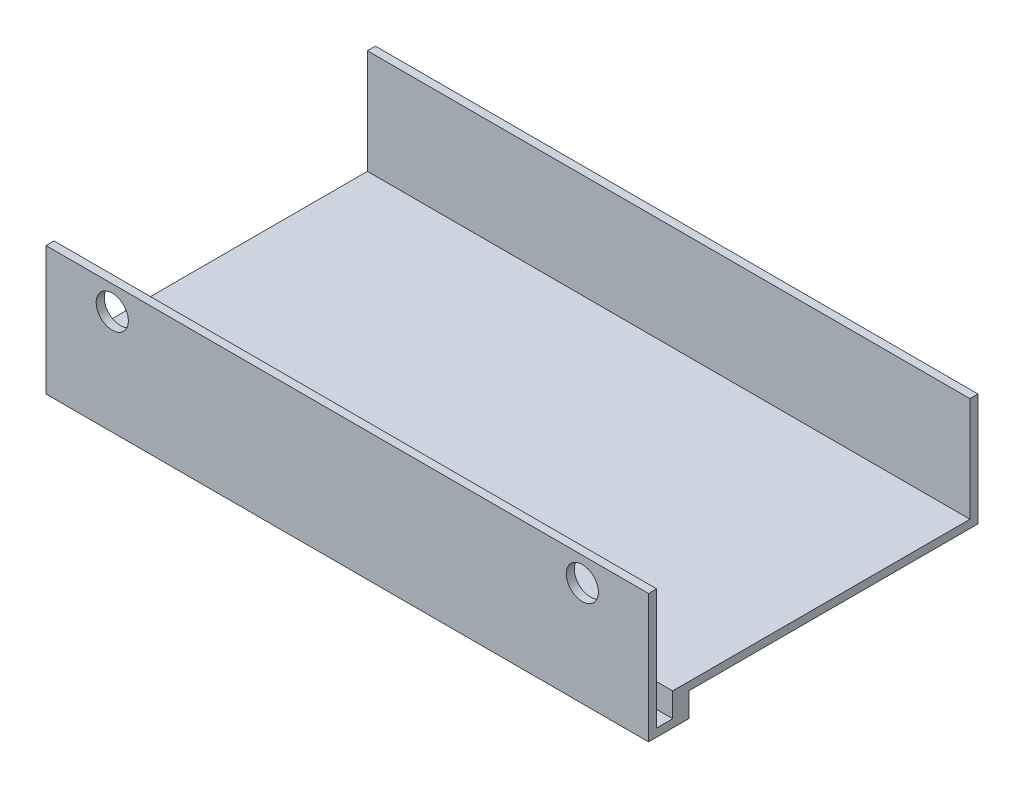
ISO-10303-21;
HEADER;
FILE_DESCRIPTION(('STEP AP214'),'2;1');
FILE_NAME('part.step','',(''),(''),'','','');
FILE_SCHEMA(('AUTOMOTIVE_DESIGN { 1 0 10303 214 1 1 1 1 }'));
ENDSEC;
DATA;
#1=APPLICATION_CONTEXT('core data for automotive mechanical design processes');
#2=APPLICATION_PROTOCOL_DEFINITION('international standard','automotive_design',2000,#1);
#3=PRODUCT_CONTEXT('',#1,'mechanical');
#4=PRODUCT('Part','Part','',(#3));
#5=PRODUCT_RELATED_PRODUCT_CATEGORY('part','',(#4));
#6=PRODUCT_DEFINITION_FORMATION('','',#4);
#7=PRODUCT_DEFINITION_CONTEXT('part definition',#1,'design');
#8=PRODUCT_DEFINITION('design','',#6,#7);
#9=PRODUCT_DEFINITION_SHAPE('','',#8);
#10=(LENGTH_UNIT() NAMED_UNIT(*) SI_UNIT(.MILLI.,.METRE.));
#11=(NAMED_UNIT(*) PLANE_ANGLE_UNIT() SI_UNIT($,.RADIAN.));
#12=(NAMED_UNIT(*) SI_UNIT($,.STERADIAN.) SOLID_ANGLE_UNIT());
#13=UNCERTAINTY_MEASURE_WITH_UNIT(LENGTH_MEASURE(1.E-05),#10,'distance_accuracy_value','');
#14=(GEOMETRIC_REPRESENTATION_CONTEXT(3) GLOBAL_UNCERTAINTY_ASSIGNED_CONTEXT((#13)) GLOBAL_UNIT_ASSIGNED_CONTEXT((#10,
#11,#12)) REPRESENTATION_CONTEXT('',''));
#15=CARTESIAN_POINT('',(0.,0.,0.));
#16=DIRECTION('',(0.,0.,1.));
#17=DIRECTION('',(1.,0.,0.));
#18=AXIS2_PLACEMENT_3D('',#15,#16,#17);
#19=CARTESIAN_POINT('',(0.,0.,-40.));
#20=DIRECTION('',(0.,0.,1.));
#21=DIRECTION('',(1.,0.,0.));
#22=AXIS2_PLACEMENT_3D('',#19,#20,#21);
#23=PLANE('',#22);
#24=DIRECTION('',(1.,0.,0.));
#25=VECTOR('',#24,1.);
#26=CARTESIAN_POINT('',(0.,2.,-40.));
#27=LINE('',#26,#25);
#28=CARTESIAN_POINT('',(0.,2.,-40.));
#29=VERTEX_POINT('',#28);
#30=CARTESIAN_POINT('',(75.,2.,-40.));
#31=VERTEX_POINT('',#30);
#32=EDGE_CURVE('E129',#29,#31,#27,.T.);
#33=ORIENTED_EDGE('',*,*,#32,.F.);
#34=DIRECTION('',(0.,-1.,0.));
#35=VECTOR('',#34,1.);
#36=CARTESIAN_POINT('',(0.,0.,-40.));
#37=LINE('',#36,#35);
#38=CARTESIAN_POINT('',(0.,16.,-40.));
#39=VERTEX_POINT('',#38);
#40=EDGE_CURVE('E140',#39,#29,#37,.T.);
#41=ORIENTED_EDGE('',*,*,#40,.F.);
#42=DIRECTION('',(-1.,0.,0.));
#43=VECTOR('',#42,1.);
#44=CARTESIAN_POINT('',(75.,16.,-40.));
#45=LINE('',#44,#43);
#46=CARTESIAN_POINT('',(75.,16.,-40.));
#47=VERTEX_POINT('',#46);
#48=EDGE_CURVE('E232',#47,#39,#45,.T.);
#49=ORIENTED_EDGE('',*,*,#48,.F.);
#50=DIRECTION('',(0.,-1.,0.));
#51=VECTOR('',#50,1.);
#52=CARTESIAN_POINT('',(75.,0.,-40.));
#53=LINE('',#52,#51);
#54=EDGE_CURVE('E142',#47,#31,#53,.T.);
#55=ORIENTED_EDGE('',*,*,#54,.T.);
#56=EDGE_LOOP('',(#33,#41,#49,#55));
#57=FACE_BOUND('',#56,.T.);
#58=ADVANCED_FACE('F35',(#57),#23,.F.);
#59=CARTESIAN_POINT('',(0.,0.,-40.));
#60=DIRECTION('',(0.,-1.,0.));
#61=DIRECTION('',(0.,0.,-1.));
#62=AXIS2_PLACEMENT_3D('',#59,#60,#61);
#63=PLANE('',#62);
#64=DIRECTION('',(1.,0.,0.));
#65=VECTOR('',#64,1.);
#66=CARTESIAN_POINT('',(75.,0.,-2.));
#67=LINE('',#66,#65);
#68=CARTESIAN_POINT('',(0.,0.,-1.99999999999999));
#69=VERTEX_POINT('',#68);
#70=CARTESIAN_POINT('',(75.,0.,-2.));
#71=VERTEX_POINT('',#70);
#72=EDGE_CURVE('E214',#69,#71,#67,.T.);
#73=ORIENTED_EDGE('',*,*,#72,.F.);
#74=DIRECTION('',(0.,0.,1.));
#75=VECTOR('',#74,1.);
#76=CARTESIAN_POINT('',(0.,0.,-40.));
#77=LINE('',#76,#75);
#78=CARTESIAN_POINT('',(0.,0.,0.));
#79=VERTEX_POINT('',#78);
#80=EDGE_CURVE('E58',#69,#79,#77,.T.);
#81=ORIENTED_EDGE('',*,*,#80,.T.);
#82=DIRECTION('',(1.,0.,0.));
#83=VECTOR('',#82,1.);
#84=CARTESIAN_POINT('',(0.,0.,0.));
#85=LINE('',#84,#83);
#86=CARTESIAN_POINT('',(75.,0.,0.));
#87=VERTEX_POINT('',#86);
#88=EDGE_CURVE('E152',#79,#87,#85,.T.);
#89=ORIENTED_EDGE('',*,*,#88,.T.);
#90=DIRECTION('',(0.,0.,1.));
#91=VECTOR('',#90,1.);
#92=CARTESIAN_POINT('',(75.,0.,-40.));
#93=LINE('',#92,#91);
#94=EDGE_CURVE('E149',#71,#87,#93,.T.);
#95=ORIENTED_EDGE('',*,*,#94,.F.);
#96=EDGE_LOOP('',(#73,#81,#89,#95));
#97=FACE_BOUND('',#96,.T.);
#98=ADVANCED_FACE('F265',(#97),#63,.F.);
#99=CARTESIAN_POINT('',(0.,0.,0.));
#100=DIRECTION('',(0.,0.,1.));
#101=DIRECTION('',(1.,0.,0.));
#102=AXIS2_PLACEMENT_3D('',#99,#100,#101);
#103=PLANE('',#102);
#104=CARTESIAN_POINT('',(8.25,12.,0.));
#105=DIRECTION('',(0.,0.,1.));
#106=DIRECTION('',(1.,0.,0.));
#107=AXIS2_PLACEMENT_3D('',#104,#105,#106);
#108=CIRCLE('',#107,2.);
#109=CARTESIAN_POINT('',(10.25,12.,0.));
#110=VERTEX_POINT('',#109);
#111=EDGE_CURVE('E181',#110,#110,#108,.T.);
#112=ORIENTED_EDGE('',*,*,#111,.T.);
#113=EDGE_LOOP('',(#112));
#114=FACE_BOUND('',#113,.T.);
#115=CARTESIAN_POINT('',(66.75,12.,0.));
#116=DIRECTION('',(0.,0.,1.));
#117=DIRECTION('',(1.,0.,0.));
#118=AXIS2_PLACEMENT_3D('',#115,#116,#117);
#119=CIRCLE('',#118,2.);
#120=CARTESIAN_POINT('',(68.75,12.,0.));
#121=VERTEX_POINT('',#120);
#122=EDGE_CURVE('E158',#121,#121,#119,.T.);
#123=ORIENTED_EDGE('',*,*,#122,.T.);
#124=EDGE_LOOP('',(#123));
#125=FACE_BOUND('',#124,.T.);
#126=ORIENTED_EDGE('',*,*,#88,.F.);
#127=DIRECTION('',(0.,1.,0.));
#128=VECTOR('',#127,1.);
#129=CARTESIAN_POINT('',(0.,0.,0.));
#130=LINE('',#129,#128);
#131=CARTESIAN_POINT('',(0.,15.,0.));
#132=VERTEX_POINT('',#131);
#133=EDGE_CURVE('E184',#79,#132,#130,.T.);
#134=ORIENTED_EDGE('',*,*,#133,.T.);
#135=DIRECTION('',(1.,0.,0.));
#136=VECTOR('',#135,1.);
#137=CARTESIAN_POINT('',(0.,15.,0.));
#138=LINE('',#137,#136);
#139=CARTESIAN_POINT('',(75.,15.,0.));
#140=VERTEX_POINT('',#139);
#141=EDGE_CURVE('E164',#132,#140,#138,.T.);
#142=ORIENTED_EDGE('',*,*,#141,.T.);
#143=DIRECTION('',(0.,1.,0.));
#144=VECTOR('',#143,1.);
#145=CARTESIAN_POINT('',(75.,0.,0.));
#146=LINE('',#145,#144);
#147=EDGE_CURVE('E186',#87,#140,#146,.T.);
#148=ORIENTED_EDGE('',*,*,#147,.F.);
#149=EDGE_LOOP('',(#126,#134,#142,#148));
#150=FACE_BOUND('',#149,.T.);
#151=ADVANCED_FACE('F270',(#114,#125,#150),#103,.F.);
#152=CARTESIAN_POINT('',(0.,0.,1.));
#153=DIRECTION('',(-1.,0.,0.));
#154=DIRECTION('',(0.,0.,1.));
#155=AXIS2_PLACEMENT_3D('',#152,#153,#154);
#156=PLANE('',#155);
#157=DIRECTION('',(0.,-1.,0.));
#158=VECTOR('',#157,1.);
#159=CARTESIAN_POINT('',(0.,2.,-4.));
#160=LINE('',#159,#158);
#161=CARTESIAN_POINT('',(0.,2.,-4.));
#162=VERTEX_POINT('',#161);
#163=CARTESIAN_POINT('',(0.,-1.,-4.));
#164=VERTEX_POINT('',#163);
#165=EDGE_CURVE('E212',#162,#164,#160,.T.);
#166=ORIENTED_EDGE('',*,*,#165,.T.);
#167=DIRECTION('',(0.,0.,-1.));
#168=VECTOR('',#167,1.);
#169=CARTESIAN_POINT('',(0.,-1.,1.));
#170=LINE('',#169,#168);
#171=CARTESIAN_POINT('',(0.,-1.,1.));
#172=VERTEX_POINT('',#171);
#173=EDGE_CURVE('E11',#172,#164,#170,.T.);
#174=ORIENTED_EDGE('',*,*,#173,.F.);
#175=DIRECTION('',(0.,1.,0.));
#176=VECTOR('',#175,1.);
#177=CARTESIAN_POINT('',(0.,0.,1.));
#178=LINE('',#177,#176);
#179=CARTESIAN_POINT('',(0.,15.,1.));
#180=VERTEX_POINT('',#179);
#181=EDGE_CURVE('E167',#172,#180,#178,.T.);
#182=ORIENTED_EDGE('',*,*,#181,.T.);
#183=DIRECTION('',(0.,0.,-1.));
#184=VECTOR('',#183,1.);
#185=CARTESIAN_POINT('',(0.,15.,1.));
#186=LINE('',#185,#184);
#187=EDGE_CURVE('E178',#180,#132,#186,.T.);
#188=ORIENTED_EDGE('',*,*,#187,.T.);
#189=ORIENTED_EDGE('',*,*,#133,.F.);
#190=ORIENTED_EDGE('',*,*,#80,.F.);
#191=DIRECTION('',(0.,-1.,0.));
#192=VECTOR('',#191,1.);
#193=CARTESIAN_POINT('',(0.,3.,-1.99999999999999));
#194=LINE('',#193,#192);
#195=CARTESIAN_POINT('',(0.,3.,-1.99999999999999));
#196=VERTEX_POINT('',#195);
#197=EDGE_CURVE('E209',#196,#69,#194,.T.);
#198=ORIENTED_EDGE('',*,*,#197,.F.);
#199=DIRECTION('',(0.,0.,1.));
#200=VECTOR('',#199,1.);
#201=CARTESIAN_POINT('',(0.,3.,-1.99999999999999));
#202=LINE('',#201,#200);
#203=CARTESIAN_POINT('',(0.,3.,-39.));
#204=VERTEX_POINT('',#203);
#205=EDGE_CURVE('E221',#204,#196,#202,.T.);
#206=ORIENTED_EDGE('',*,*,#205,.F.);
#207=DIRECTION('',(0.,-1.,0.));
#208=VECTOR('',#207,1.);
#209=CARTESIAN_POINT('',(0.,16.,-39.));
#210=LINE('',#209,#208);
#211=CARTESIAN_POINT('',(0.,16.,-39.));
#212=VERTEX_POINT('',#211);
#213=EDGE_CURVE('E157',#212,#204,#210,.T.);
#214=ORIENTED_EDGE('',*,*,#213,.F.);
#215=DIRECTION('',(0.,0.,1.));
#216=VECTOR('',#215,1.);
#217=CARTESIAN_POINT('',(0.,16.,-40.));
#218=LINE('',#217,#216);
#219=EDGE_CURVE('E148',#39,#212,#218,.T.);
#220=ORIENTED_EDGE('',*,*,#219,.F.);
#221=ORIENTED_EDGE('',*,*,#40,.T.);
#222=DIRECTION('',(0.,0.,-1.));
#223=VECTOR('',#222,1.);
#224=CARTESIAN_POINT('',(0.,2.,-4.));
#225=LINE('',#224,#223);
#226=EDGE_CURVE('E126',#162,#29,#225,.T.);
#227=ORIENTED_EDGE('',*,*,#226,.F.);
#228=EDGE_LOOP('',(#166,#174,#182,#188,#189,#190,#198,#206,#214,#220,#221,#227));
#229=FACE_BOUND('',#228,.T.);
#230=ADVANCED_FACE('F146',(#229),#156,.T.);
#231=CARTESIAN_POINT('',(0.,-1.,1.));
#232=DIRECTION('',(0.,1.,0.));
#233=DIRECTION('',(0.,0.,1.));
#234=AXIS2_PLACEMENT_3D('',#231,#232,#233);
#235=PLANE('',#234);
#236=ORIENTED_EDGE('',*,*,#173,.T.);
#237=DIRECTION('',(-1.,0.,0.));
#238=VECTOR('',#237,1.);
#239=CARTESIAN_POINT('',(5.,-1.,-4.));
#240=LINE('',#239,#238);
#241=CARTESIAN_POINT('',(75.,-1.,-4.));
#242=VERTEX_POINT('',#241);
#243=EDGE_CURVE('E206',#242,#164,#240,.T.);
#244=ORIENTED_EDGE('',*,*,#243,.F.);
#245=DIRECTION('',(0.,0.,-1.));
#246=VECTOR('',#245,1.);
#247=CARTESIAN_POINT('',(75.,-1.,1.));
#248=LINE('',#247,#246);
#249=CARTESIAN_POINT('',(75.,-1.,1.));
#250=VERTEX_POINT('',#249);
#251=EDGE_CURVE('E43',#250,#242,#248,.T.);
#252=ORIENTED_EDGE('',*,*,#251,.F.);
#253=DIRECTION('',(1.,0.,0.));
#254=VECTOR('',#253,1.);
#255=CARTESIAN_POINT('',(0.,-1.,1.));
#256=LINE('',#255,#254);
#257=EDGE_CURVE('E170',#172,#250,#256,.T.);
#258=ORIENTED_EDGE('',*,*,#257,.F.);
#259=EDGE_LOOP('',(#236,#244,#252,#258));
#260=FACE_BOUND('',#259,.T.);
#261=ADVANCED_FACE('F204',(#260),#235,.F.);
#262=CARTESIAN_POINT('',(75.,0.,1.));
#263=DIRECTION('',(-1.,0.,0.));
#264=DIRECTION('',(0.,0.,1.));
#265=AXIS2_PLACEMENT_3D('',#262,#263,#264);
#266=PLANE('',#265);
#267=ORIENTED_EDGE('',*,*,#251,.T.);
#268=DIRECTION('',(0.,-1.,0.));
#269=VECTOR('',#268,1.);
#270=CARTESIAN_POINT('',(75.,2.,-4.));
#271=LINE('',#270,#269);
#272=CARTESIAN_POINT('',(75.,2.,-4.));
#273=VERTEX_POINT('',#272);
#274=EDGE_CURVE('E200',#273,#242,#271,.T.);
#275=ORIENTED_EDGE('',*,*,#274,.F.);
#276=DIRECTION('',(0.,0.,1.));
#277=VECTOR('',#276,1.);
#278=CARTESIAN_POINT('',(75.,2.,-4.));
#279=LINE('',#278,#277);
#280=EDGE_CURVE('E143',#31,#273,#279,.T.);
#281=ORIENTED_EDGE('',*,*,#280,.F.);
#282=ORIENTED_EDGE('',*,*,#54,.F.);
#283=DIRECTION('',(0.,0.,-1.));
#284=VECTOR('',#283,1.);
#285=CARTESIAN_POINT('',(75.,16.,-40.));
#286=LINE('',#285,#284);
#287=CARTESIAN_POINT('',(75.,16.,-39.));
#288=VERTEX_POINT('',#287);
#289=EDGE_CURVE('E208',#288,#47,#286,.T.);
#290=ORIENTED_EDGE('',*,*,#289,.F.);
#291=DIRECTION('',(0.,-1.,0.));
#292=VECTOR('',#291,1.);
#293=CARTESIAN_POINT('',(75.,16.,-39.));
#294=LINE('',#293,#292);
#295=CARTESIAN_POINT('',(75.,3.,-39.));
#296=VERTEX_POINT('',#295);
#297=EDGE_CURVE('E237',#288,#296,#294,.T.);
#298=ORIENTED_EDGE('',*,*,#297,.T.);
#299=DIRECTION('',(0.,0.,-1.));
#300=VECTOR('',#299,1.);
#301=CARTESIAN_POINT('',(75.,3.,-2.));
#302=LINE('',#301,#300);
#303=CARTESIAN_POINT('',(75.,3.,-2.));
#304=VERTEX_POINT('',#303);
#305=EDGE_CURVE('E50',#304,#296,#302,.T.);
#306=ORIENTED_EDGE('',*,*,#305,.F.);
#307=DIRECTION('',(0.,-1.,0.));
#308=VECTOR('',#307,1.);
#309=CARTESIAN_POINT('',(75.,3.,-2.));
#310=LINE('',#309,#308);
#311=EDGE_CURVE('E225',#304,#71,#310,.T.);
#312=ORIENTED_EDGE('',*,*,#311,.T.);
#313=ORIENTED_EDGE('',*,*,#94,.T.);
#314=ORIENTED_EDGE('',*,*,#147,.T.);
#315=DIRECTION('',(0.,0.,-1.));
#316=VECTOR('',#315,1.);
#317=CARTESIAN_POINT('',(75.,15.,1.));
#318=LINE('',#317,#316);
#319=CARTESIAN_POINT('',(75.,15.,1.));
#320=VERTEX_POINT('',#319);
#321=EDGE_CURVE('E192',#320,#140,#318,.T.);
#322=ORIENTED_EDGE('',*,*,#321,.F.);
#323=DIRECTION('',(0.,1.,0.));
#324=VECTOR('',#323,1.);
#325=CARTESIAN_POINT('',(75.,0.,1.));
#326=LINE('',#325,#324);
#327=EDGE_CURVE('E173',#250,#320,#326,.T.);
#328=ORIENTED_EDGE('',*,*,#327,.F.);
#329=EDGE_LOOP('',(#267,#275,#281,#282,#290,#298,#306,#312,#313,#314,#322,#328));
#330=FACE_BOUND('',#329,.T.);
#331=ADVANCED_FACE('F198',(#330),#266,.F.);
#332=CARTESIAN_POINT('',(8.25,12.,1.));
#333=DIRECTION('',(0.,0.,-1.));
#334=DIRECTION('',(-1.,0.,0.));
#335=AXIS2_PLACEMENT_3D('',#332,#333,#334);
#336=CYLINDRICAL_SURFACE('',#335,2.);
#337=CARTESIAN_POINT('',(8.25,12.,1.));
#338=DIRECTION('',(0.,0.,1.));
#339=DIRECTION('',(1.,0.,0.));
#340=AXIS2_PLACEMENT_3D('',#337,#338,#339);
#341=CIRCLE('',#340,2.);
#342=CARTESIAN_POINT('',(10.25,12.,1.));
#343=VERTEX_POINT('',#342);
#344=EDGE_CURVE('E163',#343,#343,#341,.T.);
#345=ORIENTED_EDGE('',*,*,#344,.T.);
#346=EDGE_LOOP('',(#345));
#347=FACE_BOUND('',#346,.T.);
#348=ORIENTED_EDGE('',*,*,#111,.F.);
#349=EDGE_LOOP('',(#348));
#350=FACE_BOUND('',#349,.T.);
#351=ADVANCED_FACE('F285',(#347,#350),#336,.F.);
#352=CARTESIAN_POINT('',(66.75,12.,1.));
#353=DIRECTION('',(0.,0.,-1.));
#354=DIRECTION('',(-1.,0.,0.));
#355=AXIS2_PLACEMENT_3D('',#352,#353,#354);
#356=CYLINDRICAL_SURFACE('',#355,2.);
#357=CARTESIAN_POINT('',(66.75,12.,1.));
#358=DIRECTION('',(0.,0.,1.));
#359=DIRECTION('',(1.,0.,0.));
#360=AXIS2_PLACEMENT_3D('',#357,#358,#359);
#361=CIRCLE('',#360,2.);
#362=CARTESIAN_POINT('',(68.75,12.,1.));
#363=VERTEX_POINT('',#362);
#364=EDGE_CURVE('E160',#363,#363,#361,.T.);
#365=ORIENTED_EDGE('',*,*,#364,.T.);
#366=EDGE_LOOP('',(#365));
#367=FACE_BOUND('',#366,.T.);
#368=ORIENTED_EDGE('',*,*,#122,.F.);
#369=EDGE_LOOP('',(#368));
#370=FACE_BOUND('',#369,.T.);
#371=ADVANCED_FACE('F37',(#367,#370),#356,.F.);
#372=CARTESIAN_POINT('',(0.,15.,1.));
#373=DIRECTION('',(0.,1.,0.));
#374=DIRECTION('',(0.,0.,1.));
#375=AXIS2_PLACEMENT_3D('',#372,#373,#374);
#376=PLANE('',#375);
#377=ORIENTED_EDGE('',*,*,#141,.F.);
#378=ORIENTED_EDGE('',*,*,#187,.F.);
#379=DIRECTION('',(1.,0.,0.));
#380=VECTOR('',#379,1.);
#381=CARTESIAN_POINT('',(0.,15.,1.));
#382=LINE('',#381,#380);
#383=EDGE_CURVE('E175',#180,#320,#382,.T.);
#384=ORIENTED_EDGE('',*,*,#383,.T.);
#385=ORIENTED_EDGE('',*,*,#321,.T.);
#386=EDGE_LOOP('',(#377,#378,#384,#385));
#387=FACE_BOUND('',#386,.T.);
#388=ADVANCED_FACE('F275',(#387),#376,.T.);
#389=CARTESIAN_POINT('',(0.,0.,1.));
#390=DIRECTION('',(0.,0.,1.));
#391=DIRECTION('',(1.,0.,0.));
#392=AXIS2_PLACEMENT_3D('',#389,#390,#391);
#393=PLANE('',#392);
#394=ORIENTED_EDGE('',*,*,#364,.F.);
#395=EDGE_LOOP('',(#394));
#396=FACE_BOUND('',#395,.T.);
#397=ORIENTED_EDGE('',*,*,#344,.F.);
#398=EDGE_LOOP('',(#397));
#399=FACE_BOUND('',#398,.T.);
#400=ORIENTED_EDGE('',*,*,#181,.F.);
#401=ORIENTED_EDGE('',*,*,#257,.T.);
#402=ORIENTED_EDGE('',*,*,#327,.T.);
#403=ORIENTED_EDGE('',*,*,#383,.F.);
#404=EDGE_LOOP('',(#400,#401,#402,#403));
#405=FACE_BOUND('',#404,.T.);
#406=ADVANCED_FACE('F262',(#396,#399,#405),#393,.T.);
#407=CARTESIAN_POINT('',(75.,16.,-39.));
#408=DIRECTION('',(0.,0.,-1.));
#409=DIRECTION('',(-1.,0.,0.));
#410=AXIS2_PLACEMENT_3D('',#407,#408,#409);
#411=PLANE('',#410);
#412=ORIENTED_EDGE('',*,*,#213,.T.);
#413=DIRECTION('',(-1.,0.,0.));
#414=VECTOR('',#413,1.);
#415=CARTESIAN_POINT('',(75.,3.,-39.));
#416=LINE('',#415,#414);
#417=EDGE_CURVE('E219',#296,#204,#416,.T.);
#418=ORIENTED_EDGE('',*,*,#417,.F.);
#419=ORIENTED_EDGE('',*,*,#297,.F.);
#420=DIRECTION('',(1.,0.,0.));
#421=VECTOR('',#420,1.);
#422=CARTESIAN_POINT('',(75.,16.,-39.));
#423=LINE('',#422,#421);
#424=EDGE_CURVE('E235',#212,#288,#423,.T.);
#425=ORIENTED_EDGE('',*,*,#424,.F.);
#426=EDGE_LOOP('',(#412,#418,#419,#425));
#427=FACE_BOUND('',#426,.T.);
#428=ADVANCED_FACE('F242',(#427),#411,.F.);
#429=CARTESIAN_POINT('',(0.,16.,0.));
#430=DIRECTION('',(0.,-1.,0.));
#431=DIRECTION('',(0.,0.,-1.));
#432=AXIS2_PLACEMENT_3D('',#429,#430,#431);
#433=PLANE('',#432);
#434=ORIENTED_EDGE('',*,*,#289,.T.);
#435=ORIENTED_EDGE('',*,*,#48,.T.);
#436=ORIENTED_EDGE('',*,*,#219,.T.);
#437=ORIENTED_EDGE('',*,*,#424,.T.);
#438=EDGE_LOOP('',(#434,#435,#436,#437));
#439=FACE_BOUND('',#438,.T.);
#440=ADVANCED_FACE('F254',(#439),#433,.F.);
#441=CARTESIAN_POINT('',(5.,2.,-4.));
#442=DIRECTION('',(0.,0.,1.));
#443=DIRECTION('',(1.,0.,0.));
#444=AXIS2_PLACEMENT_3D('',#441,#442,#443);
#445=PLANE('',#444);
#446=ORIENTED_EDGE('',*,*,#243,.T.);
#447=ORIENTED_EDGE('',*,*,#165,.F.);
#448=DIRECTION('',(-1.,0.,0.));
#449=VECTOR('',#448,1.);
#450=CARTESIAN_POINT('',(0.,2.,-4.));
#451=LINE('',#450,#449);
#452=EDGE_CURVE('E132',#273,#162,#451,.T.);
#453=ORIENTED_EDGE('',*,*,#452,.F.);
#454=ORIENTED_EDGE('',*,*,#274,.T.);
#455=EDGE_LOOP('',(#446,#447,#453,#454));
#456=FACE_BOUND('',#455,.T.);
#457=ADVANCED_FACE('F211',(#456),#445,.F.);
#458=CARTESIAN_POINT('',(75.,3.,-2.));
#459=DIRECTION('',(0.,0.,-1.));
#460=DIRECTION('',(-1.,0.,0.));
#461=AXIS2_PLACEMENT_3D('',#458,#459,#460);
#462=PLANE('',#461);
#463=ORIENTED_EDGE('',*,*,#72,.T.);
#464=ORIENTED_EDGE('',*,*,#311,.F.);
#465=DIRECTION('',(1.,0.,0.));
#466=VECTOR('',#465,1.);
#467=CARTESIAN_POINT('',(75.,3.,-2.));
#468=LINE('',#467,#466);
#469=EDGE_CURVE('E223',#196,#304,#468,.T.);
#470=ORIENTED_EDGE('',*,*,#469,.F.);
#471=ORIENTED_EDGE('',*,*,#197,.T.);
#472=EDGE_LOOP('',(#463,#464,#470,#471));
#473=FACE_BOUND('',#472,.T.);
#474=ADVANCED_FACE('F250',(#473),#462,.F.);
#475=CARTESIAN_POINT('',(0.,3.,0.));
#476=DIRECTION('',(0.,1.,0.));
#477=DIRECTION('',(0.,0.,1.));
#478=AXIS2_PLACEMENT_3D('',#475,#476,#477);
#479=PLANE('',#478);
#480=ORIENTED_EDGE('',*,*,#305,.T.);
#481=ORIENTED_EDGE('',*,*,#417,.T.);
#482=ORIENTED_EDGE('',*,*,#205,.T.);
#483=ORIENTED_EDGE('',*,*,#469,.T.);
#484=EDGE_LOOP('',(#480,#481,#482,#483));
#485=FACE_BOUND('',#484,.T.);
#486=ADVANCED_FACE('F247',(#485),#479,.T.);
#487=CARTESIAN_POINT('',(0.,2.,0.));
#488=DIRECTION('',(0.,-1.,0.));
#489=DIRECTION('',(0.,0.,-1.));
#490=AXIS2_PLACEMENT_3D('',#487,#488,#489);
#491=PLANE('',#490);
#492=ORIENTED_EDGE('',*,*,#226,.T.);
#493=ORIENTED_EDGE('',*,*,#32,.T.);
#494=ORIENTED_EDGE('',*,*,#280,.T.);
#495=ORIENTED_EDGE('',*,*,#452,.T.);
#496=EDGE_LOOP('',(#492,#493,#494,#495));
#497=FACE_BOUND('',#496,.T.);
#498=ADVANCED_FACE('F128',(#497),#491,.T.);
#499=CLOSED_SHELL('',(#58,#98,#151,#230,#261,#331,#351,#371,#388,#406,#428,#440,#457,#474,#486,#498));
#500=MANIFOLD_SOLID_BREP('B2',#499);
#501=ADVANCED_BREP_SHAPE_REPRESENTATION('',(#18,#500),#14);
#502=SHAPE_DEFINITION_REPRESENTATION(#9,#501);
ENDSEC;
END-ISO-10303-21;
